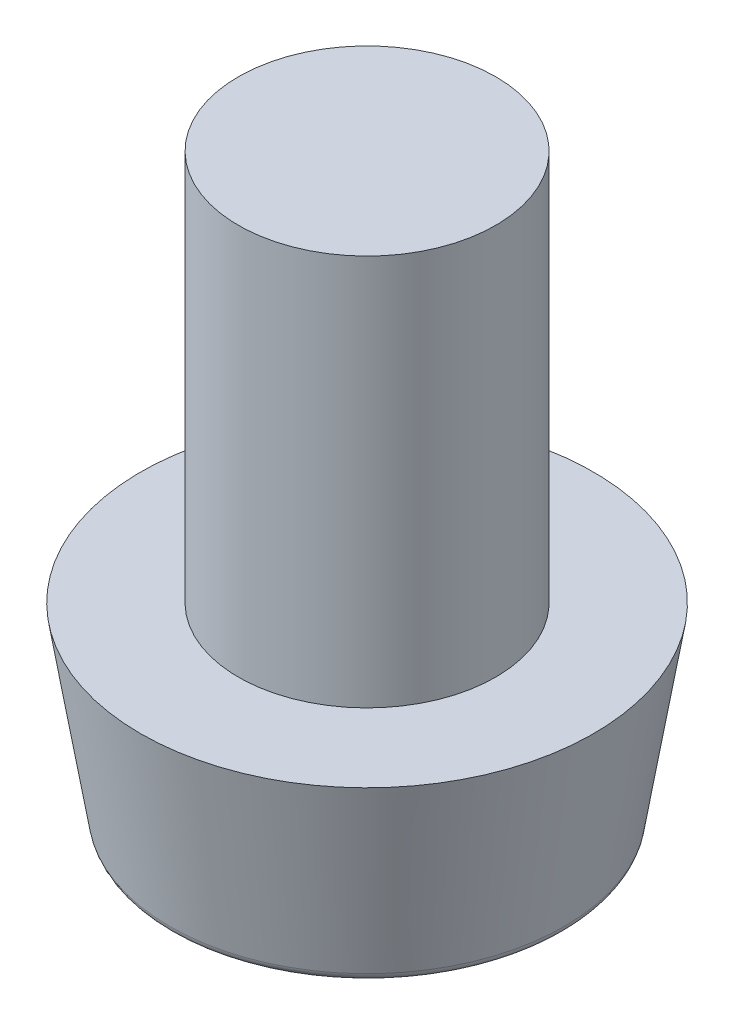
ISO-10303-21;
HEADER;
FILE_DESCRIPTION(('STEP AP214'),'2;1');
FILE_NAME('part.step','',(''),(''),'','','');
FILE_SCHEMA(('AUTOMOTIVE_DESIGN { 1 0 10303 214 1 1 1 1 }'));
ENDSEC;
DATA;
#1=APPLICATION_CONTEXT('core data for automotive mechanical design processes');
#2=APPLICATION_PROTOCOL_DEFINITION('international standard','automotive_design',2000,#1);
#3=PRODUCT_CONTEXT('',#1,'mechanical');
#4=PRODUCT('Part','Part','',(#3));
#5=PRODUCT_RELATED_PRODUCT_CATEGORY('part','',(#4));
#6=PRODUCT_DEFINITION_FORMATION('','',#4);
#7=PRODUCT_DEFINITION_CONTEXT('part definition',#1,'design');
#8=PRODUCT_DEFINITION('design','',#6,#7);
#9=PRODUCT_DEFINITION_SHAPE('','',#8);
#10=(LENGTH_UNIT() NAMED_UNIT(*) SI_UNIT(.MILLI.,.METRE.));
#11=(NAMED_UNIT(*) PLANE_ANGLE_UNIT() SI_UNIT($,.RADIAN.));
#12=(NAMED_UNIT(*) SI_UNIT($,.STERADIAN.) SOLID_ANGLE_UNIT());
#13=UNCERTAINTY_MEASURE_WITH_UNIT(LENGTH_MEASURE(1.E-05),#10,'distance_accuracy_value','');
#14=(GEOMETRIC_REPRESENTATION_CONTEXT(3) GLOBAL_UNCERTAINTY_ASSIGNED_CONTEXT((#13)) GLOBAL_UNIT_ASSIGNED_CONTEXT((#10,
#11,#12)) REPRESENTATION_CONTEXT('',''));
#15=CARTESIAN_POINT('',(0.,0.,0.));
#16=DIRECTION('',(0.,0.,1.));
#17=DIRECTION('',(1.,0.,0.));
#18=AXIS2_PLACEMENT_3D('',#15,#16,#17);
#19=CARTESIAN_POINT('',(0.,1.85,0.));
#20=DIRECTION('',(0.,1.,0.));
#21=DIRECTION('',(0.,0.,1.));
#22=AXIS2_PLACEMENT_3D('',#19,#20,#21);
#23=PLANE('',#22);
#24=CARTESIAN_POINT('',(0.,1.85,0.));
#25=DIRECTION('',(0.,1.,0.));
#26=DIRECTION('',(0.,0.,1.));
#27=AXIS2_PLACEMENT_3D('',#24,#25,#26);
#28=CIRCLE('',#27,1.25);
#29=CARTESIAN_POINT('',(0.,1.85,-1.25));
#30=VERTEX_POINT('',#29);
#31=EDGE_CURVE('E50',#30,#30,#28,.T.);
#32=ORIENTED_EDGE('',*,*,#31,.F.);
#33=EDGE_LOOP('',(#32));
#34=FACE_BOUND('',#33,.T.);
#35=CARTESIAN_POINT('',(0.,1.85,0.));
#36=DIRECTION('',(0.,1.,0.));
#37=DIRECTION('',(0.,0.,1.));
#38=AXIS2_PLACEMENT_3D('',#35,#36,#37);
#39=CIRCLE('',#38,2.19999999999999);
#40=CARTESIAN_POINT('',(0.,1.85,2.19999999999999));
#41=VERTEX_POINT('',#40);
#42=EDGE_CURVE('E55',#41,#41,#39,.T.);
#43=ORIENTED_EDGE('',*,*,#42,.T.);
#44=EDGE_LOOP('',(#43));
#45=FACE_BOUND('',#44,.T.);
#46=ADVANCED_FACE('F37',(#34,#45),#23,.T.);
#47=CARTESIAN_POINT('',(0.,0.,0.));
#48=DIRECTION('',(0.,1.,0.));
#49=DIRECTION('',(0.,0.,1.));
#50=AXIS2_PLACEMENT_3D('',#47,#48,#49);
#51=PLANE('',#50);
#52=CARTESIAN_POINT('',(0.,0.,0.));
#53=DIRECTION('',(0.,1.,0.));
#54=DIRECTION('',(0.,0.,1.));
#55=AXIS2_PLACEMENT_3D('',#52,#53,#54);
#56=CIRCLE('',#55,1.81490991992436);
#57=CARTESIAN_POINT('',(0.,0.,1.81490991992436));
#58=VERTEX_POINT('',#57);
#59=EDGE_CURVE('E45',#58,#58,#56,.F.);
#60=ORIENTED_EDGE('',*,*,#59,.T.);
#61=EDGE_LOOP('',(#60));
#62=FACE_BOUND('',#61,.T.);
#63=ADVANCED_FACE('F71',(#62),#51,.F.);
#64=CARTESIAN_POINT('',(0.,5.65,0.));
#65=DIRECTION('',(0.,-1.,0.));
#66=DIRECTION('',(0.,0.,-1.));
#67=AXIS2_PLACEMENT_3D('',#64,#65,#66);
#68=CYLINDRICAL_SURFACE('',#67,1.25);
#69=CARTESIAN_POINT('',(0.,5.65,0.));
#70=DIRECTION('',(0.,1.,0.));
#71=DIRECTION('',(0.,0.,1.));
#72=AXIS2_PLACEMENT_3D('',#69,#70,#71);
#73=CIRCLE('',#72,1.25);
#74=CARTESIAN_POINT('',(0.,5.65,-1.25));
#75=VERTEX_POINT('',#74);
#76=EDGE_CURVE('E60',#75,#75,#73,.T.);
#77=CARTESIAN_POINT('',(0.,5.65,-1.25));
#78=CARTESIAN_POINT('',(0.,5.61041666666667,-1.25));
#79=CARTESIAN_POINT('',(0.,5.57083333333333,-1.25));
#80=CARTESIAN_POINT('',(0.,5.49166666666667,-1.25));
#81=CARTESIAN_POINT('',(0.,5.45208333333333,-1.25));
#82=CARTESIAN_POINT('',(0.,5.37291666666667,-1.25));
#83=CARTESIAN_POINT('',(0.,5.33333333333333,-1.25));
#84=CARTESIAN_POINT('',(0.,5.25416666666667,-1.25));
#85=CARTESIAN_POINT('',(0.,5.21458333333333,-1.25));
#86=CARTESIAN_POINT('',(0.,5.13541666666667,-1.25));
#87=CARTESIAN_POINT('',(0.,5.09583333333333,-1.25));
#88=CARTESIAN_POINT('',(0.,5.01666666666667,-1.25));
#89=CARTESIAN_POINT('',(0.,4.97708333333333,-1.25));
#90=CARTESIAN_POINT('',(0.,4.89791666666667,-1.25));
#91=CARTESIAN_POINT('',(0.,4.85833333333333,-1.25));
#92=CARTESIAN_POINT('',(0.,4.77916666666667,-1.25));
#93=CARTESIAN_POINT('',(0.,4.73958333333333,-1.25));
#94=CARTESIAN_POINT('',(0.,4.66041666666667,-1.25));
#95=CARTESIAN_POINT('',(0.,4.62083333333333,-1.25));
#96=CARTESIAN_POINT('',(0.,4.54166666666667,-1.25));
#97=CARTESIAN_POINT('',(0.,4.50208333333333,-1.25));
#98=CARTESIAN_POINT('',(0.,4.42291666666667,-1.25));
#99=CARTESIAN_POINT('',(0.,4.38333333333333,-1.25));
#100=CARTESIAN_POINT('',(0.,4.30416666666667,-1.25));
#101=CARTESIAN_POINT('',(0.,4.26458333333333,-1.25));
#102=CARTESIAN_POINT('',(0.,4.18541666666667,-1.25));
#103=CARTESIAN_POINT('',(0.,4.14583333333333,-1.25));
#104=CARTESIAN_POINT('',(0.,4.06666666666667,-1.25));
#105=CARTESIAN_POINT('',(0.,4.02708333333333,-1.25));
#106=CARTESIAN_POINT('',(0.,3.94791666666667,-1.25));
#107=CARTESIAN_POINT('',(0.,3.90833333333333,-1.25));
#108=CARTESIAN_POINT('',(0.,3.82916666666667,-1.25));
#109=CARTESIAN_POINT('',(0.,3.78958333333333,-1.25));
#110=CARTESIAN_POINT('',(0.,3.71041666666667,-1.25));
#111=CARTESIAN_POINT('',(0.,3.67083333333333,-1.25));
#112=CARTESIAN_POINT('',(0.,3.59166666666667,-1.25));
#113=CARTESIAN_POINT('',(0.,3.55208333333333,-1.25));
#114=CARTESIAN_POINT('',(0.,3.47291666666667,-1.25));
#115=CARTESIAN_POINT('',(0.,3.43333333333333,-1.25));
#116=CARTESIAN_POINT('',(0.,3.35416666666667,-1.25));
#117=CARTESIAN_POINT('',(0.,3.31458333333333,-1.25));
#118=CARTESIAN_POINT('',(0.,3.23541666666667,-1.25));
#119=CARTESIAN_POINT('',(0.,3.19583333333333,-1.25));
#120=CARTESIAN_POINT('',(0.,3.11666666666667,-1.25));
#121=CARTESIAN_POINT('',(0.,3.07708333333333,-1.25));
#122=CARTESIAN_POINT('',(0.,2.99791666666667,-1.25));
#123=CARTESIAN_POINT('',(0.,2.95833333333333,-1.25));
#124=CARTESIAN_POINT('',(0.,2.87916666666667,-1.25));
#125=CARTESIAN_POINT('',(0.,2.83958333333333,-1.25));
#126=CARTESIAN_POINT('',(0.,2.76041666666667,-1.25));
#127=CARTESIAN_POINT('',(0.,2.72083333333333,-1.25));
#128=CARTESIAN_POINT('',(0.,2.64166666666667,-1.25));
#129=CARTESIAN_POINT('',(0.,2.60208333333333,-1.25));
#130=CARTESIAN_POINT('',(0.,2.52291666666667,-1.25));
#131=CARTESIAN_POINT('',(0.,2.48333333333333,-1.25));
#132=CARTESIAN_POINT('',(0.,2.40416666666667,-1.25));
#133=CARTESIAN_POINT('',(0.,2.36458333333333,-1.25));
#134=CARTESIAN_POINT('',(0.,2.28541666666667,-1.25));
#135=CARTESIAN_POINT('',(0.,2.24583333333333,-1.25));
#136=CARTESIAN_POINT('',(0.,2.16666666666667,-1.25));
#137=CARTESIAN_POINT('',(0.,2.12708333333333,-1.25));
#138=CARTESIAN_POINT('',(0.,2.04791666666667,-1.25));
#139=CARTESIAN_POINT('',(0.,2.00833333333333,-1.25));
#140=CARTESIAN_POINT('',(0.,1.92916666666667,-1.25));
#141=CARTESIAN_POINT('',(0.,1.88958333333333,-1.25));
#142=CARTESIAN_POINT('',(0.,1.85,-1.25));
#143=B_SPLINE_CURVE_WITH_KNOTS('',3,(#77,#78,#79,#80,#81,#82,#83,#84,#85,#86,#87,#88,#89,#90,
#91,#92,#93,#94,#95,#96,#97,#98,#99,#100,#101,#102,#103,#104,#105,#106,#107,#108,#109,#110,#111,
#112,#113,#114,#115,#116,#117,#118,#119,#120,#121,#122,#123,#124,#125,#126,#127,#128,#129,#130,
#131,#132,#133,#134,#135,#136,#137,#138,#139,#140,#141,#142),.UNSPECIFIED.,.F.,.F.,(4,2,2,2,2,2,
2,2,2,2,2,2,2,2,2,2,2,2,2,2,2,2,2,2,2,2,2,2,2,2,2,2,4),(0.,0.118750000000001,0.237500000000001,
0.356250000000001,0.475000000000001,0.593750000000001,0.7125,0.83125,0.95,1.06875,1.1875,
1.30625,1.425,1.54375,1.6625,1.78125,1.9,2.01875,2.1375,2.25625,2.375,2.49375,2.6125,2.73125,
2.85,2.96875,3.0875,3.20625,3.325,3.44375,3.5625,3.68125,3.8),.UNSPECIFIED.);
#144=EDGE_CURVE('BSEAM68',#75,#30,#143,.T.);
#145=ORIENTED_EDGE('',*,*,#76,.F.);
#146=ORIENTED_EDGE('',*,*,#31,.T.);
#147=ORIENTED_EDGE('',*,*,#144,.T.);
#148=ORIENTED_EDGE('',*,*,#144,.F.);
#149=EDGE_LOOP('',(#145,#147,#146,#148));
#150=FACE_BOUND('',#149,.T.);
#151=ADVANCED_FACE('F68',(#150),#68,.T.);
#152=CARTESIAN_POINT('',(0.,5.65,0.));
#153=DIRECTION('',(0.,1.,0.));
#154=DIRECTION('',(0.,0.,1.));
#155=AXIS2_PLACEMENT_3D('',#152,#153,#154);
#156=PLANE('',#155);
#157=ORIENTED_EDGE('',*,*,#76,.T.);
#158=EDGE_LOOP('',(#157));
#159=FACE_BOUND('',#158,.T.);
#160=ADVANCED_FACE('F66',(#159),#156,.T.);
#161=CARTESIAN_POINT('',(0.,1.85000000000004,0.));
#162=DIRECTION('',(0.,1.,0.));
#163=DIRECTION('',(0.,0.,1.));
#164=AXIS2_PLACEMENT_3D('',#161,#162,#163);
#165=CONICAL_SURFACE('',#164,2.19999999999999,0.160762740625832);
#166=CARTESIAN_POINT('',(0.,0.0839928841446341,0.));
#167=DIRECTION('',(0.,1.,0.));
#168=DIRECTION('',(0.,0.,1.));
#169=AXIS2_PLACEMENT_3D('',#166,#167,#168);
#170=CIRCLE('',#169,1.91362046769912);
#171=CARTESIAN_POINT('',(0.,0.0839928841446341,1.91362046769912));
#172=VERTEX_POINT('',#171);
#173=EDGE_CURVE('E10',#172,#172,#170,.T.);
#174=ORIENTED_EDGE('',*,*,#173,.T.);
#175=EDGE_LOOP('',(#174));
#176=FACE_BOUND('',#175,.T.);
#177=ORIENTED_EDGE('',*,*,#42,.F.);
#178=EDGE_LOOP('',(#177));
#179=FACE_BOUND('',#178,.T.);
#180=ADVANCED_FACE('F80',(#176,#179),#165,.T.);
#181=CARTESIAN_POINT('',(0.,0.1,0.));
#182=DIRECTION('',(0.,1.,0.));
#183=DIRECTION('',(0.,0.,1.));
#184=AXIS2_PLACEMENT_3D('',#181,#182,#183);
#185=TOROIDAL_SURFACE('',#184,1.81490991992436,0.1);
#186=ORIENTED_EDGE('',*,*,#173,.F.);
#187=EDGE_LOOP('',(#186));
#188=FACE_BOUND('',#187,.T.);
#189=ORIENTED_EDGE('',*,*,#59,.F.);
#190=EDGE_LOOP('',(#189));
#191=FACE_BOUND('',#190,.T.);
#192=ADVANCED_FACE('F39',(#188,#191),#185,.T.);
#193=CLOSED_SHELL('',(#46,#63,#151,#160,#180,#192));
#194=MANIFOLD_SOLID_BREP('B2',#193);
#195=ADVANCED_BREP_SHAPE_REPRESENTATION('',(#18,#194),#14);
#196=SHAPE_DEFINITION_REPRESENTATION(#9,#195);
ENDSEC;
END-ISO-10303-21;
